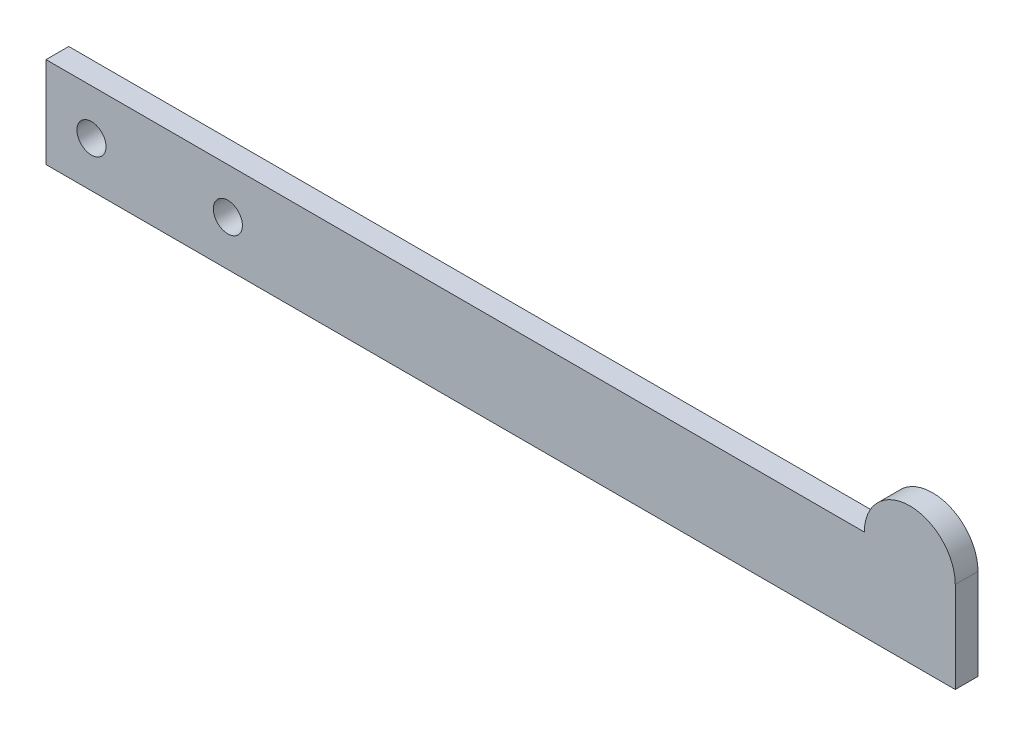
ISO-10303-21;
HEADER;
FILE_DESCRIPTION(('STEP AP214'),'2;1');
FILE_NAME('part.step','',(''),(''),'','','');
FILE_SCHEMA(('AUTOMOTIVE_DESIGN { 1 0 10303 214 1 1 1 1 }'));
ENDSEC;
DATA;
#1=APPLICATION_CONTEXT('core data for automotive mechanical design processes');
#2=APPLICATION_PROTOCOL_DEFINITION('international standard','automotive_design',2000,#1);
#3=PRODUCT_CONTEXT('',#1,'mechanical');
#4=PRODUCT('Part','Part','',(#3));
#5=PRODUCT_RELATED_PRODUCT_CATEGORY('part','',(#4));
#6=PRODUCT_DEFINITION_FORMATION('','',#4);
#7=PRODUCT_DEFINITION_CONTEXT('part definition',#1,'design');
#8=PRODUCT_DEFINITION('design','',#6,#7);
#9=PRODUCT_DEFINITION_SHAPE('','',#8);
#10=(LENGTH_UNIT() NAMED_UNIT(*) SI_UNIT(.MILLI.,.METRE.));
#11=(NAMED_UNIT(*) PLANE_ANGLE_UNIT() SI_UNIT($,.RADIAN.));
#12=(NAMED_UNIT(*) SI_UNIT($,.STERADIAN.) SOLID_ANGLE_UNIT());
#13=UNCERTAINTY_MEASURE_WITH_UNIT(LENGTH_MEASURE(1.E-05),#10,'distance_accuracy_value','');
#14=(GEOMETRIC_REPRESENTATION_CONTEXT(3) GLOBAL_UNCERTAINTY_ASSIGNED_CONTEXT((#13)) GLOBAL_UNIT_ASSIGNED_CONTEXT((#10,
#11,#12)) REPRESENTATION_CONTEXT('',''));
#15=CARTESIAN_POINT('',(0.,0.,0.));
#16=DIRECTION('',(0.,0.,1.));
#17=DIRECTION('',(1.,0.,0.));
#18=AXIS2_PLACEMENT_3D('',#15,#16,#17);
#19=CARTESIAN_POINT('',(63.5,6.35,3.175));
#20=DIRECTION('',(0.,-1.,0.));
#21=DIRECTION('',(1.,0.,0.));
#22=AXIS2_PLACEMENT_3D('',#19,#20,#21);
#23=PLANE('',#22);
#24=DIRECTION('',(0.,0.,1.));
#25=VECTOR('',#24,1.);
#26=CARTESIAN_POINT('',(50.8,6.35,0.));
#27=LINE('',#26,#25);
#28=CARTESIAN_POINT('',(50.8,6.35,0.));
#29=VERTEX_POINT('',#28);
#30=CARTESIAN_POINT('',(50.8,6.35,3.175));
#31=VERTEX_POINT('',#30);
#32=EDGE_CURVE('E53',#29,#31,#27,.T.);
#33=ORIENTED_EDGE('',*,*,#32,.F.);
#34=DIRECTION('',(-1.,0.,0.));
#35=VECTOR('',#34,1.);
#36=CARTESIAN_POINT('',(63.5,6.35,0.));
#37=LINE('',#36,#35);
#38=CARTESIAN_POINT('',(-63.5000000000001,6.34999999999999,0.));
#39=VERTEX_POINT('',#38);
#40=EDGE_CURVE('E79',#29,#39,#37,.T.);
#41=ORIENTED_EDGE('',*,*,#40,.T.);
#42=DIRECTION('',(0.,0.,-1.));
#43=VECTOR('',#42,1.);
#44=CARTESIAN_POINT('',(-63.5000000000001,6.34999999999999,3.175));
#45=LINE('',#44,#43);
#46=CARTESIAN_POINT('',(-63.5000000000001,6.34999999999999,3.175));
#47=VERTEX_POINT('',#46);
#48=EDGE_CURVE('E87',#47,#39,#45,.T.);
#49=ORIENTED_EDGE('',*,*,#48,.F.);
#50=DIRECTION('',(-1.,0.,0.));
#51=VECTOR('',#50,1.);
#52=CARTESIAN_POINT('',(63.5,6.35,3.175));
#53=LINE('',#52,#51);
#54=EDGE_CURVE('E65',#31,#47,#53,.T.);
#55=ORIENTED_EDGE('',*,*,#54,.F.);
#56=EDGE_LOOP('',(#33,#41,#49,#55));
#57=FACE_BOUND('',#56,.T.);
#58=ADVANCED_FACE('F39',(#57),#23,.F.);
#59=CARTESIAN_POINT('',(0.,0.,3.175));
#60=DIRECTION('',(0.,0.,1.));
#61=DIRECTION('',(1.,0.,0.));
#62=AXIS2_PLACEMENT_3D('',#59,#60,#61);
#63=PLANE('',#62);
#64=CARTESIAN_POINT('',(-57.15,0.,3.175));
#65=DIRECTION('',(0.,0.,1.));
#66=DIRECTION('',(1.,0.,0.));
#67=AXIS2_PLACEMENT_3D('',#64,#65,#66);
#68=CIRCLE('',#67,2.032);
#69=CARTESIAN_POINT('',(-55.118,0.,3.175));
#70=VERTEX_POINT('',#69);
#71=EDGE_CURVE('E118',#70,#70,#68,.T.);
#72=ORIENTED_EDGE('',*,*,#71,.F.);
#73=EDGE_LOOP('',(#72));
#74=FACE_BOUND('',#73,.T.);
#75=DIRECTION('',(0.,-1.,0.));
#76=VECTOR('',#75,1.);
#77=CARTESIAN_POINT('',(-63.5000000000001,-6.35000000000001,3.175));
#78=LINE('',#77,#76);
#79=CARTESIAN_POINT('',(-63.5000000000001,-6.35000000000001,3.175));
#80=VERTEX_POINT('',#79);
#81=EDGE_CURVE('E122',#47,#80,#78,.T.);
#82=ORIENTED_EDGE('',*,*,#81,.T.);
#83=DIRECTION('',(1.,0.,0.));
#84=VECTOR('',#83,1.);
#85=CARTESIAN_POINT('',(63.5,-6.34999999999999,3.175));
#86=LINE('',#85,#84);
#87=CARTESIAN_POINT('',(63.5,-6.34999999999999,3.175));
#88=VERTEX_POINT('',#87);
#89=EDGE_CURVE('E90',#80,#88,#86,.T.);
#90=ORIENTED_EDGE('',*,*,#89,.T.);
#91=DIRECTION('',(0.,1.,0.));
#92=VECTOR('',#91,1.);
#93=CARTESIAN_POINT('',(63.5,-6.34999999999999,3.175));
#94=LINE('',#93,#92);
#95=CARTESIAN_POINT('',(63.5,6.35,3.175));
#96=VERTEX_POINT('',#95);
#97=EDGE_CURVE('E91',#88,#96,#94,.T.);
#98=ORIENTED_EDGE('',*,*,#97,.T.);
#99=CARTESIAN_POINT('',(57.15,6.35000000000001,3.175));
#100=DIRECTION('',(0.,0.,1.));
#101=DIRECTION('',(-1.,0.,0.));
#102=AXIS2_PLACEMENT_3D('',#99,#100,#101);
#103=CIRCLE('',#102,6.35);
#104=EDGE_CURVE('E97',#96,#31,#103,.T.);
#105=ORIENTED_EDGE('',*,*,#104,.T.);
#106=ORIENTED_EDGE('',*,*,#54,.T.);
#107=EDGE_LOOP('',(#82,#90,#98,#105,#106));
#108=FACE_BOUND('',#107,.T.);
#109=CARTESIAN_POINT('',(-38.1,0.,3.175));
#110=DIRECTION('',(0.,0.,1.));
#111=DIRECTION('',(1.,0.,0.));
#112=AXIS2_PLACEMENT_3D('',#109,#110,#111);
#113=CIRCLE('',#112,2.032);
#114=CARTESIAN_POINT('',(-36.068,0.,3.175));
#115=VERTEX_POINT('',#114);
#116=EDGE_CURVE('E109',#115,#115,#113,.T.);
#117=ORIENTED_EDGE('',*,*,#116,.F.);
#118=EDGE_LOOP('',(#117));
#119=FACE_BOUND('',#118,.T.);
#120=ADVANCED_FACE('F104',(#74,#108,#119),#63,.T.);
#121=CARTESIAN_POINT('',(0.,0.,0.));
#122=DIRECTION('',(0.,0.,1.));
#123=DIRECTION('',(1.,0.,0.));
#124=AXIS2_PLACEMENT_3D('',#121,#122,#123);
#125=PLANE('',#124);
#126=DIRECTION('',(0.,-1.,0.));
#127=VECTOR('',#126,1.);
#128=CARTESIAN_POINT('',(-63.5000000000001,-6.35000000000001,0.));
#129=LINE('',#128,#127);
#130=CARTESIAN_POINT('',(-63.5000000000001,-6.35000000000001,0.));
#131=VERTEX_POINT('',#130);
#132=EDGE_CURVE('E117',#39,#131,#129,.T.);
#133=ORIENTED_EDGE('',*,*,#132,.F.);
#134=ORIENTED_EDGE('',*,*,#40,.F.);
#135=CARTESIAN_POINT('',(57.15,6.35000000000001,0.));
#136=DIRECTION('',(0.,0.,1.));
#137=DIRECTION('',(-1.,0.,0.));
#138=AXIS2_PLACEMENT_3D('',#135,#136,#137);
#139=CIRCLE('',#138,6.35);
#140=CARTESIAN_POINT('',(63.5,6.35,0.));
#141=VERTEX_POINT('',#140);
#142=EDGE_CURVE('E99',#141,#29,#139,.T.);
#143=ORIENTED_EDGE('',*,*,#142,.F.);
#144=DIRECTION('',(0.,1.,0.));
#145=VECTOR('',#144,1.);
#146=CARTESIAN_POINT('',(63.5,-6.34999999999999,0.));
#147=LINE('',#146,#145);
#148=CARTESIAN_POINT('',(63.5,-6.34999999999999,0.));
#149=VERTEX_POINT('',#148);
#150=EDGE_CURVE('E127',#149,#141,#147,.T.);
#151=ORIENTED_EDGE('',*,*,#150,.F.);
#152=DIRECTION('',(1.,0.,0.));
#153=VECTOR('',#152,1.);
#154=CARTESIAN_POINT('',(63.5,-6.34999999999999,0.));
#155=LINE('',#154,#153);
#156=EDGE_CURVE('E126',#131,#149,#155,.T.);
#157=ORIENTED_EDGE('',*,*,#156,.F.);
#158=EDGE_LOOP('',(#133,#134,#143,#151,#157));
#159=FACE_BOUND('',#158,.T.);
#160=CARTESIAN_POINT('',(-57.15,0.,0.));
#161=DIRECTION('',(0.,0.,1.));
#162=DIRECTION('',(1.,0.,0.));
#163=AXIS2_PLACEMENT_3D('',#160,#161,#162);
#164=CIRCLE('',#163,2.032);
#165=CARTESIAN_POINT('',(-55.118,0.,0.));
#166=VERTEX_POINT('',#165);
#167=EDGE_CURVE('E111',#166,#166,#164,.T.);
#168=ORIENTED_EDGE('',*,*,#167,.T.);
#169=EDGE_LOOP('',(#168));
#170=FACE_BOUND('',#169,.T.);
#171=CARTESIAN_POINT('',(-38.1,0.,0.));
#172=DIRECTION('',(0.,0.,1.));
#173=DIRECTION('',(1.,0.,0.));
#174=AXIS2_PLACEMENT_3D('',#171,#172,#173);
#175=CIRCLE('',#174,2.032);
#176=CARTESIAN_POINT('',(-36.068,0.,0.));
#177=VERTEX_POINT('',#176);
#178=EDGE_CURVE('E102',#177,#177,#175,.T.);
#179=ORIENTED_EDGE('',*,*,#178,.T.);
#180=EDGE_LOOP('',(#179));
#181=FACE_BOUND('',#180,.T.);
#182=ADVANCED_FACE('F141',(#159,#170,#181),#125,.F.);
#183=CARTESIAN_POINT('',(-63.5000000000001,-6.35000000000001,3.175));
#184=DIRECTION('',(1.,0.,0.));
#185=DIRECTION('',(0.,0.,-1.));
#186=AXIS2_PLACEMENT_3D('',#183,#184,#185);
#187=PLANE('',#186);
#188=ORIENTED_EDGE('',*,*,#132,.T.);
#189=DIRECTION('',(0.,0.,-1.));
#190=VECTOR('',#189,1.);
#191=CARTESIAN_POINT('',(-63.5000000000001,-6.35000000000001,3.175));
#192=LINE('',#191,#190);
#193=EDGE_CURVE('E11',#80,#131,#192,.T.);
#194=ORIENTED_EDGE('',*,*,#193,.F.);
#195=ORIENTED_EDGE('',*,*,#81,.F.);
#196=ORIENTED_EDGE('',*,*,#48,.T.);
#197=EDGE_LOOP('',(#188,#194,#195,#196));
#198=FACE_BOUND('',#197,.T.);
#199=ADVANCED_FACE('F41',(#198),#187,.F.);
#200=CARTESIAN_POINT('',(63.5,-6.34999999999999,3.175));
#201=DIRECTION('',(0.,1.,0.));
#202=DIRECTION('',(-1.,0.,0.));
#203=AXIS2_PLACEMENT_3D('',#200,#201,#202);
#204=PLANE('',#203);
#205=ORIENTED_EDGE('',*,*,#156,.T.);
#206=DIRECTION('',(0.,0.,-1.));
#207=VECTOR('',#206,1.);
#208=CARTESIAN_POINT('',(63.5,-6.34999999999999,3.175));
#209=LINE('',#208,#207);
#210=EDGE_CURVE('E50',#88,#149,#209,.T.);
#211=ORIENTED_EDGE('',*,*,#210,.F.);
#212=ORIENTED_EDGE('',*,*,#89,.F.);
#213=ORIENTED_EDGE('',*,*,#193,.T.);
#214=EDGE_LOOP('',(#205,#211,#212,#213));
#215=FACE_BOUND('',#214,.T.);
#216=ADVANCED_FACE('F144',(#215),#204,.F.);
#217=CARTESIAN_POINT('',(63.5,-6.34999999999999,3.175));
#218=DIRECTION('',(-1.,0.,0.));
#219=DIRECTION('',(0.,0.,1.));
#220=AXIS2_PLACEMENT_3D('',#217,#218,#219);
#221=PLANE('',#220);
#222=ORIENTED_EDGE('',*,*,#150,.T.);
#223=DIRECTION('',(0.,0.,-1.));
#224=VECTOR('',#223,1.);
#225=CARTESIAN_POINT('',(63.5,6.35,3.175));
#226=LINE('',#225,#224);
#227=EDGE_CURVE('E132',#96,#141,#226,.T.);
#228=ORIENTED_EDGE('',*,*,#227,.F.);
#229=ORIENTED_EDGE('',*,*,#97,.F.);
#230=ORIENTED_EDGE('',*,*,#210,.T.);
#231=EDGE_LOOP('',(#222,#228,#229,#230));
#232=FACE_BOUND('',#231,.T.);
#233=ADVANCED_FACE('F138',(#232),#221,.F.);
#234=CARTESIAN_POINT('',(-57.15,0.,3.175));
#235=DIRECTION('',(0.,0.,-1.));
#236=DIRECTION('',(-1.,0.,0.));
#237=AXIS2_PLACEMENT_3D('',#234,#235,#236);
#238=CYLINDRICAL_SURFACE('',#237,2.032);
#239=ORIENTED_EDGE('',*,*,#71,.T.);
#240=EDGE_LOOP('',(#239));
#241=FACE_BOUND('',#240,.T.);
#242=ORIENTED_EDGE('',*,*,#167,.F.);
#243=EDGE_LOOP('',(#242));
#244=FACE_BOUND('',#243,.T.);
#245=ADVANCED_FACE('F155',(#241,#244),#238,.F.);
#246=CARTESIAN_POINT('',(-38.1,0.,3.175));
#247=DIRECTION('',(0.,0.,-1.));
#248=DIRECTION('',(-1.,0.,0.));
#249=AXIS2_PLACEMENT_3D('',#246,#247,#248);
#250=CYLINDRICAL_SURFACE('',#249,2.032);
#251=ORIENTED_EDGE('',*,*,#116,.T.);
#252=EDGE_LOOP('',(#251));
#253=FACE_BOUND('',#252,.T.);
#254=ORIENTED_EDGE('',*,*,#178,.F.);
#255=EDGE_LOOP('',(#254));
#256=FACE_BOUND('',#255,.T.);
#257=ADVANCED_FACE('F168',(#253,#256),#250,.F.);
#258=CARTESIAN_POINT('',(57.15,6.35000000000001,0.));
#259=DIRECTION('',(0.,0.,1.));
#260=DIRECTION('',(1.,0.,0.));
#261=AXIS2_PLACEMENT_3D('',#258,#259,#260);
#262=CYLINDRICAL_SURFACE('',#261,6.35);
#263=ORIENTED_EDGE('',*,*,#104,.F.);
#264=ORIENTED_EDGE('',*,*,#227,.T.);
#265=ORIENTED_EDGE('',*,*,#142,.T.);
#266=ORIENTED_EDGE('',*,*,#32,.T.);
#267=EDGE_LOOP('',(#263,#264,#265,#266));
#268=FACE_BOUND('',#267,.T.);
#269=ADVANCED_FACE('F96',(#268),#262,.T.);
#270=CLOSED_SHELL('',(#58,#120,#182,#199,#216,#233,#245,#257,#269));
#271=MANIFOLD_SOLID_BREP('B2',#270);
#272=ADVANCED_BREP_SHAPE_REPRESENTATION('',(#18,#271),#14);
#273=SHAPE_DEFINITION_REPRESENTATION(#9,#272);
ENDSEC;
END-ISO-10303-21;
